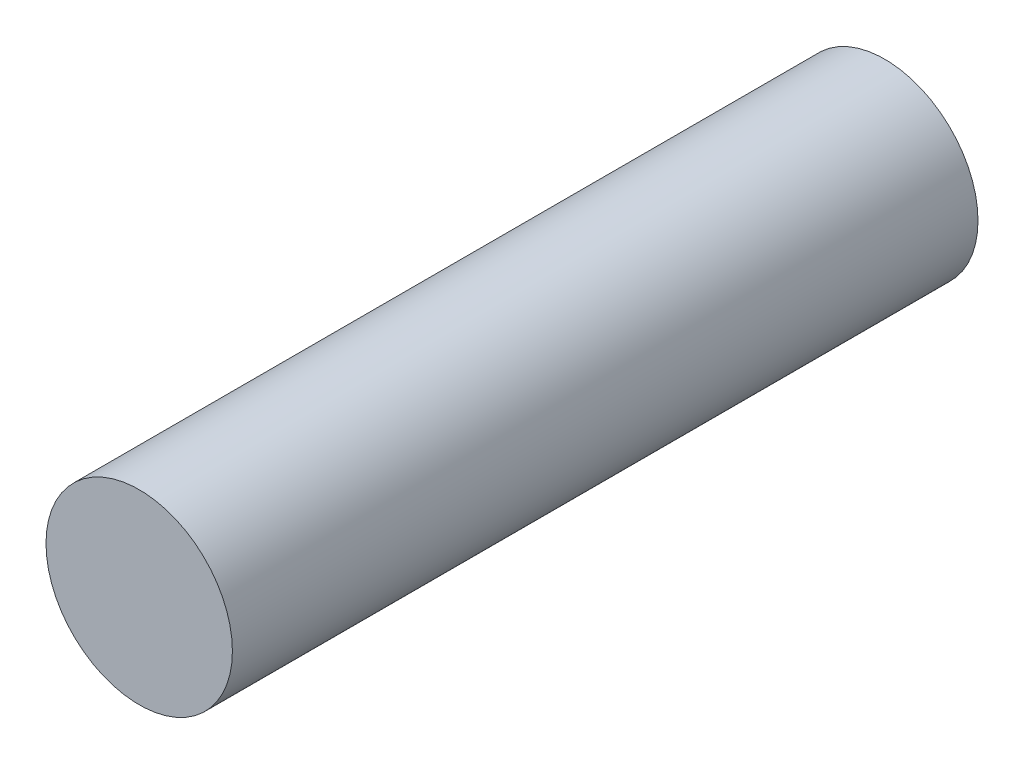
ISO-10303-21;
HEADER;
FILE_DESCRIPTION(('STEP AP214'),'2;1');
FILE_NAME('part.step','',(''),(''),'','','');
FILE_SCHEMA(('AUTOMOTIVE_DESIGN { 1 0 10303 214 1 1 1 1 }'));
ENDSEC;
DATA;
#1=APPLICATION_CONTEXT('core data for automotive mechanical design processes');
#2=APPLICATION_PROTOCOL_DEFINITION('international standard','automotive_design',2000,#1);
#3=PRODUCT_CONTEXT('',#1,'mechanical');
#4=PRODUCT('Part','Part','',(#3));
#5=PRODUCT_RELATED_PRODUCT_CATEGORY('part','',(#4));
#6=PRODUCT_DEFINITION_FORMATION('','',#4);
#7=PRODUCT_DEFINITION_CONTEXT('part definition',#1,'design');
#8=PRODUCT_DEFINITION('design','',#6,#7);
#9=PRODUCT_DEFINITION_SHAPE('','',#8);
#10=(LENGTH_UNIT() NAMED_UNIT(*) SI_UNIT(.MILLI.,.METRE.));
#11=(NAMED_UNIT(*) PLANE_ANGLE_UNIT() SI_UNIT($,.RADIAN.));
#12=(NAMED_UNIT(*) SI_UNIT($,.STERADIAN.) SOLID_ANGLE_UNIT());
#13=UNCERTAINTY_MEASURE_WITH_UNIT(LENGTH_MEASURE(1.E-05),#10,'distance_accuracy_value','');
#14=(GEOMETRIC_REPRESENTATION_CONTEXT(3) GLOBAL_UNCERTAINTY_ASSIGNED_CONTEXT((#13)) GLOBAL_UNIT_ASSIGNED_CONTEXT((#10,
#11,#12)) REPRESENTATION_CONTEXT('',''));
#15=CARTESIAN_POINT('',(0.,0.,0.));
#16=DIRECTION('',(0.,0.,1.));
#17=DIRECTION('',(1.,0.,0.));
#18=AXIS2_PLACEMENT_3D('',#15,#16,#17);
#19=CARTESIAN_POINT('',(0.,0.,400.));
#20=DIRECTION('',(0.,0.,-1.));
#21=DIRECTION('',(-1.,0.,0.));
#22=AXIS2_PLACEMENT_3D('',#19,#20,#21);
#23=CYLINDRICAL_SURFACE('',#22,50.);
#24=CARTESIAN_POINT('',(0.,0.,400.));
#25=DIRECTION('',(0.,0.,1.));
#26=DIRECTION('',(1.,0.,0.));
#27=AXIS2_PLACEMENT_3D('',#24,#25,#26);
#28=CIRCLE('',#27,50.);
#29=CARTESIAN_POINT('',(50.,0.,400.));
#30=VERTEX_POINT('',#29);
#31=EDGE_CURVE('E10',#30,#30,#28,.T.);
#32=ORIENTED_EDGE('',*,*,#31,.F.);
#33=EDGE_LOOP('',(#32));
#34=FACE_BOUND('',#33,.T.);
#35=CARTESIAN_POINT('',(0.,0.,0.));
#36=DIRECTION('',(0.,0.,1.));
#37=DIRECTION('',(1.,0.,0.));
#38=AXIS2_PLACEMENT_3D('',#35,#36,#37);
#39=CIRCLE('',#38,50.);
#40=CARTESIAN_POINT('',(50.,0.,0.));
#41=VERTEX_POINT('',#40);
#42=EDGE_CURVE('E40',#41,#41,#39,.T.);
#43=ORIENTED_EDGE('',*,*,#42,.T.);
#44=EDGE_LOOP('',(#43));
#45=FACE_BOUND('',#44,.T.);
#46=ADVANCED_FACE('F37',(#34,#45),#23,.T.);
#47=CARTESIAN_POINT('',(0.,0.,400.));
#48=DIRECTION('',(0.,0.,1.));
#49=DIRECTION('',(1.,0.,0.));
#50=AXIS2_PLACEMENT_3D('',#47,#48,#49);
#51=PLANE('',#50);
#52=ORIENTED_EDGE('',*,*,#31,.T.);
#53=EDGE_LOOP('',(#52));
#54=FACE_BOUND('',#53,.T.);
#55=ADVANCED_FACE('F54',(#54),#51,.T.);
#56=CARTESIAN_POINT('',(0.,0.,0.));
#57=DIRECTION('',(0.,0.,1.));
#58=DIRECTION('',(1.,0.,0.));
#59=AXIS2_PLACEMENT_3D('',#56,#57,#58);
#60=PLANE('',#59);
#61=ORIENTED_EDGE('',*,*,#42,.F.);
#62=EDGE_LOOP('',(#61));
#63=FACE_BOUND('',#62,.T.);
#64=ADVANCED_FACE('F52',(#63),#60,.F.);
#65=CLOSED_SHELL('',(#46,#55,#64));
#66=MANIFOLD_SOLID_BREP('B2',#65);
#67=ADVANCED_BREP_SHAPE_REPRESENTATION('',(#18,#66),#14);
#68=SHAPE_DEFINITION_REPRESENTATION(#9,#67);
ENDSEC;
END-ISO-10303-21;
